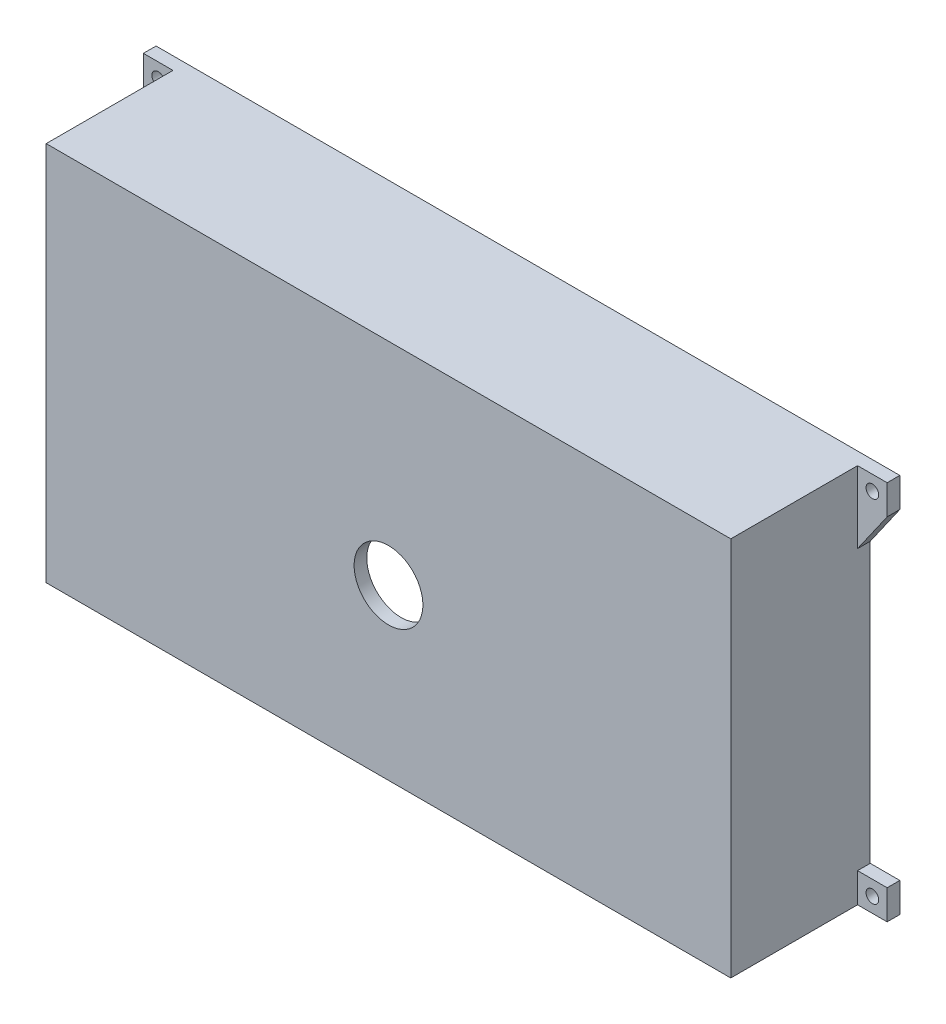
ISO-10303-21;
HEADER;
FILE_DESCRIPTION(('STEP AP214'),'2;1');
FILE_NAME('part.step','',(''),(''),'','','');
FILE_SCHEMA(('AUTOMOTIVE_DESIGN { 1 0 10303 214 1 1 1 1 }'));
ENDSEC;
DATA;
#1=APPLICATION_CONTEXT('core data for automotive mechanical design processes');
#2=APPLICATION_PROTOCOL_DEFINITION('international standard','automotive_design',2000,#1);
#3=PRODUCT_CONTEXT('',#1,'mechanical');
#4=PRODUCT('Part','Part','',(#3));
#5=PRODUCT_RELATED_PRODUCT_CATEGORY('part','',(#4));
#6=PRODUCT_DEFINITION_FORMATION('','',#4);
#7=PRODUCT_DEFINITION_CONTEXT('part definition',#1,'design');
#8=PRODUCT_DEFINITION('design','',#6,#7);
#9=PRODUCT_DEFINITION_SHAPE('','',#8);
#10=(LENGTH_UNIT() NAMED_UNIT(*) SI_UNIT(.MILLI.,.METRE.));
#11=(NAMED_UNIT(*) PLANE_ANGLE_UNIT() SI_UNIT($,.RADIAN.));
#12=(NAMED_UNIT(*) SI_UNIT($,.STERADIAN.) SOLID_ANGLE_UNIT());
#13=UNCERTAINTY_MEASURE_WITH_UNIT(LENGTH_MEASURE(1.E-05),#10,'distance_accuracy_value','');
#14=(GEOMETRIC_REPRESENTATION_CONTEXT(3) GLOBAL_UNCERTAINTY_ASSIGNED_CONTEXT((#13)) GLOBAL_UNIT_ASSIGNED_CONTEXT((#10,
#11,#12)) REPRESENTATION_CONTEXT('',''));
#15=CARTESIAN_POINT('',(0.,0.,0.));
#16=DIRECTION('',(0.,0.,1.));
#17=DIRECTION('',(1.,0.,0.));
#18=AXIS2_PLACEMENT_3D('',#15,#16,#17);
#19=CARTESIAN_POINT('',(162.,0.,33.));
#20=DIRECTION('',(-1.,0.,0.));
#21=DIRECTION('',(0.,0.,1.));
#22=AXIS2_PLACEMENT_3D('',#19,#20,#21);
#23=PLANE('',#22);
#24=DIRECTION('',(0.,0.,-1.));
#25=VECTOR('',#24,1.);
#26=CARTESIAN_POINT('',(162.,73.,3.));
#27=LINE('',#26,#25);
#28=CARTESIAN_POINT('',(162.,73.,3.));
#29=VERTEX_POINT('',#28);
#30=CARTESIAN_POINT('',(162.,73.,0.));
#31=VERTEX_POINT('',#30);
#32=EDGE_CURVE('E62',#29,#31,#27,.T.);
#33=ORIENTED_EDGE('',*,*,#32,.F.);
#34=DIRECTION('',(0.,1.,0.));
#35=VECTOR('',#34,1.);
#36=CARTESIAN_POINT('',(162.,0.,3.));
#37=LINE('',#36,#35);
#38=CARTESIAN_POINT('',(162.,90.,3.));
#39=VERTEX_POINT('',#38);
#40=EDGE_CURVE('E218',#29,#39,#37,.T.);
#41=ORIENTED_EDGE('',*,*,#40,.T.);
#42=DIRECTION('',(0.,0.,-1.));
#43=VECTOR('',#42,1.);
#44=CARTESIAN_POINT('',(162.,90.,33.));
#45=LINE('',#44,#43);
#46=CARTESIAN_POINT('',(162.,90.,33.));
#47=VERTEX_POINT('',#46);
#48=EDGE_CURVE('E356',#47,#39,#45,.T.);
#49=ORIENTED_EDGE('',*,*,#48,.F.);
#50=DIRECTION('',(0.,1.,0.));
#51=VECTOR('',#50,1.);
#52=CARTESIAN_POINT('',(162.,0.,33.));
#53=LINE('',#52,#51);
#54=CARTESIAN_POINT('',(162.,0.,33.));
#55=VERTEX_POINT('',#54);
#56=EDGE_CURVE('E340',#55,#47,#53,.T.);
#57=ORIENTED_EDGE('',*,*,#56,.F.);
#58=DIRECTION('',(0.,0.,-1.));
#59=VECTOR('',#58,1.);
#60=CARTESIAN_POINT('',(162.,0.,33.));
#61=LINE('',#60,#59);
#62=CARTESIAN_POINT('',(162.,0.,3.));
#63=VERTEX_POINT('',#62);
#64=EDGE_CURVE('E47',#55,#63,#61,.T.);
#65=ORIENTED_EDGE('',*,*,#64,.T.);
#66=DIRECTION('',(0.,1.,0.));
#67=VECTOR('',#66,1.);
#68=CARTESIAN_POINT('',(162.,0.,3.));
#69=LINE('',#68,#67);
#70=CARTESIAN_POINT('',(162.,6.99999999999998,3.));
#71=VERTEX_POINT('',#70);
#72=EDGE_CURVE('E243',#63,#71,#69,.T.);
#73=ORIENTED_EDGE('',*,*,#72,.T.);
#74=DIRECTION('',(0.,0.,-1.));
#75=VECTOR('',#74,1.);
#76=CARTESIAN_POINT('',(162.,6.99999999999998,3.));
#77=LINE('',#76,#75);
#78=CARTESIAN_POINT('',(162.,6.99999999999998,0.));
#79=VERTEX_POINT('',#78);
#80=EDGE_CURVE('E257',#71,#79,#77,.T.);
#81=ORIENTED_EDGE('',*,*,#80,.T.);
#82=DIRECTION('',(0.,1.,0.));
#83=VECTOR('',#82,1.);
#84=CARTESIAN_POINT('',(162.,0.,0.));
#85=LINE('',#84,#83);
#86=EDGE_CURVE('E351',#79,#31,#85,.T.);
#87=ORIENTED_EDGE('',*,*,#86,.T.);
#88=EDGE_LOOP('',(#33,#41,#49,#57,#65,#73,#81,#87));
#89=FACE_BOUND('',#88,.T.);
#90=ADVANCED_FACE('F39',(#89),#23,.F.);
#91=CARTESIAN_POINT('',(3.56857400772371E-13,0.,33.));
#92=DIRECTION('',(1.,0.,0.));
#93=DIRECTION('',(0.,1.,0.));
#94=AXIS2_PLACEMENT_3D('',#91,#92,#93);
#95=PLANE('',#94);
#96=DIRECTION('',(0.,0.,-1.));
#97=VECTOR('',#96,1.);
#98=CARTESIAN_POINT('',(0.,7.00000000000003,3.));
#99=LINE('',#98,#97);
#100=CARTESIAN_POINT('',(3.29101825156742E-13,7.00000000000003,3.));
#101=VERTEX_POINT('',#100);
#102=CARTESIAN_POINT('',(3.29101825156742E-13,7.00000000000003,0.));
#103=VERTEX_POINT('',#102);
#104=EDGE_CURVE('E297',#101,#103,#99,.T.);
#105=ORIENTED_EDGE('',*,*,#104,.F.);
#106=DIRECTION('',(0.,1.,0.));
#107=VECTOR('',#106,1.);
#108=CARTESIAN_POINT('',(0.,0.,3.));
#109=LINE('',#108,#107);
#110=CARTESIAN_POINT('',(0.,0.,3.));
#111=VERTEX_POINT('',#110);
#112=EDGE_CURVE('E283',#111,#101,#109,.T.);
#113=ORIENTED_EDGE('',*,*,#112,.F.);
#114=DIRECTION('',(0.,0.,-1.));
#115=VECTOR('',#114,1.);
#116=CARTESIAN_POINT('',(0.,0.,33.));
#117=LINE('',#116,#115);
#118=CARTESIAN_POINT('',(0.,0.,33.));
#119=VERTEX_POINT('',#118);
#120=EDGE_CURVE('E11',#119,#111,#117,.T.);
#121=ORIENTED_EDGE('',*,*,#120,.F.);
#122=DIRECTION('',(0.,-1.,0.));
#123=VECTOR('',#122,1.);
#124=CARTESIAN_POINT('',(3.56857400772371E-13,0.,33.));
#125=LINE('',#124,#123);
#126=CARTESIAN_POINT('',(0.,90.,33.));
#127=VERTEX_POINT('',#126);
#128=EDGE_CURVE('E334',#127,#119,#125,.T.);
#129=ORIENTED_EDGE('',*,*,#128,.F.);
#130=DIRECTION('',(0.,0.,-1.));
#131=VECTOR('',#130,1.);
#132=CARTESIAN_POINT('',(0.,90.,33.));
#133=LINE('',#132,#131);
#134=CARTESIAN_POINT('',(0.,90.,3.));
#135=VERTEX_POINT('',#134);
#136=EDGE_CURVE('E345',#127,#135,#133,.T.);
#137=ORIENTED_EDGE('',*,*,#136,.T.);
#138=DIRECTION('',(0.,-1.,0.));
#139=VECTOR('',#138,1.);
#140=CARTESIAN_POINT('',(-2.02615701994091E-13,0.,3.));
#141=LINE('',#140,#139);
#142=CARTESIAN_POINT('',(0.,73.,3.));
#143=VERTEX_POINT('',#142);
#144=EDGE_CURVE('E307',#135,#143,#141,.T.);
#145=ORIENTED_EDGE('',*,*,#144,.T.);
#146=DIRECTION('',(0.,0.,-1.));
#147=VECTOR('',#146,1.);
#148=CARTESIAN_POINT('',(0.,73.,3.));
#149=LINE('',#148,#147);
#150=CARTESIAN_POINT('',(0.,73.,0.));
#151=VERTEX_POINT('',#150);
#152=EDGE_CURVE('E330',#143,#151,#149,.T.);
#153=ORIENTED_EDGE('',*,*,#152,.T.);
#154=DIRECTION('',(0.,-1.,0.));
#155=VECTOR('',#154,1.);
#156=CARTESIAN_POINT('',(3.56857400772371E-13,0.,0.));
#157=LINE('',#156,#155);
#158=EDGE_CURVE('E333',#151,#103,#157,.T.);
#159=ORIENTED_EDGE('',*,*,#158,.T.);
#160=EDGE_LOOP('',(#105,#113,#121,#129,#137,#145,#153,#159));
#161=FACE_BOUND('',#160,.T.);
#162=ADVANCED_FACE('F41',(#161),#95,.F.);
#163=CARTESIAN_POINT('',(0.,0.,33.));
#164=DIRECTION('',(0.,1.,0.));
#165=DIRECTION('',(0.,0.,1.));
#166=AXIS2_PLACEMENT_3D('',#163,#164,#165);
#167=PLANE('',#166);
#168=DIRECTION('',(1.,0.,0.));
#169=VECTOR('',#168,1.);
#170=CARTESIAN_POINT('',(0.,0.,0.));
#171=LINE('',#170,#169);
#172=CARTESIAN_POINT('',(-7.00000000000001,0.,0.));
#173=VERTEX_POINT('',#172);
#174=CARTESIAN_POINT('',(2.99999999999999,0.,0.));
#175=VERTEX_POINT('',#174);
#176=EDGE_CURVE('E348',#173,#175,#171,.T.);
#177=ORIENTED_EDGE('',*,*,#176,.T.);
#178=DIRECTION('',(0.,0.,-1.));
#179=VECTOR('',#178,1.);
#180=CARTESIAN_POINT('',(2.99999999999999,0.,30.));
#181=LINE('',#180,#179);
#182=CARTESIAN_POINT('',(2.99999999999999,0.,30.));
#183=VERTEX_POINT('',#182);
#184=EDGE_CURVE('E208',#183,#175,#181,.T.);
#185=ORIENTED_EDGE('',*,*,#184,.F.);
#186=DIRECTION('',(-1.,0.,0.));
#187=VECTOR('',#186,1.);
#188=CARTESIAN_POINT('',(159.,0.,30.));
#189=LINE('',#188,#187);
#190=CARTESIAN_POINT('',(159.,0.,30.));
#191=VERTEX_POINT('',#190);
#192=EDGE_CURVE('E183',#191,#183,#189,.T.);
#193=ORIENTED_EDGE('',*,*,#192,.F.);
#194=DIRECTION('',(0.,0.,-1.));
#195=VECTOR('',#194,1.);
#196=CARTESIAN_POINT('',(159.,0.,30.));
#197=LINE('',#196,#195);
#198=CARTESIAN_POINT('',(159.,0.,0.));
#199=VERTEX_POINT('',#198);
#200=EDGE_CURVE('E211',#191,#199,#197,.T.);
#201=ORIENTED_EDGE('',*,*,#200,.T.);
#202=CARTESIAN_POINT('',(169.,0.,0.));
#203=VERTEX_POINT('',#202);
#204=EDGE_CURVE('E347',#199,#203,#171,.T.);
#205=ORIENTED_EDGE('',*,*,#204,.T.);
#206=DIRECTION('',(0.,0.,-1.));
#207=VECTOR('',#206,1.);
#208=CARTESIAN_POINT('',(169.,0.,3.));
#209=LINE('',#208,#207);
#210=CARTESIAN_POINT('',(169.,0.,3.));
#211=VERTEX_POINT('',#210);
#212=EDGE_CURVE('E269',#211,#203,#209,.T.);
#213=ORIENTED_EDGE('',*,*,#212,.F.);
#214=DIRECTION('',(1.,0.,0.));
#215=VECTOR('',#214,1.);
#216=CARTESIAN_POINT('',(0.,6.42343321390269E-13,3.));
#217=LINE('',#216,#215);
#218=EDGE_CURVE('E246',#63,#211,#217,.T.);
#219=ORIENTED_EDGE('',*,*,#218,.F.);
#220=ORIENTED_EDGE('',*,*,#64,.F.);
#221=DIRECTION('',(1.,0.,0.));
#222=VECTOR('',#221,1.);
#223=CARTESIAN_POINT('',(0.,0.,33.));
#224=LINE('',#223,#222);
#225=EDGE_CURVE('E337',#119,#55,#224,.T.);
#226=ORIENTED_EDGE('',*,*,#225,.F.);
#227=ORIENTED_EDGE('',*,*,#120,.T.);
#228=DIRECTION('',(-1.,0.,0.));
#229=VECTOR('',#228,1.);
#230=CARTESIAN_POINT('',(0.,0.,3.));
#231=LINE('',#230,#229);
#232=CARTESIAN_POINT('',(-7.00000000000001,0.,3.));
#233=VERTEX_POINT('',#232);
#234=EDGE_CURVE('E280',#111,#233,#231,.T.);
#235=ORIENTED_EDGE('',*,*,#234,.T.);
#236=DIRECTION('',(0.,0.,-1.));
#237=VECTOR('',#236,1.);
#238=CARTESIAN_POINT('',(-7.00000000000001,0.,3.));
#239=LINE('',#238,#237);
#240=EDGE_CURVE('E300',#233,#173,#239,.T.);
#241=ORIENTED_EDGE('',*,*,#240,.T.);
#242=EDGE_LOOP('',(#177,#185,#193,#201,#205,#213,#219,#220,#226,#227,#235,#241));
#243=FACE_BOUND('',#242,.T.);
#244=ADVANCED_FACE('F364',(#243),#167,.F.);
#245=CARTESIAN_POINT('',(0.,90.,33.));
#246=DIRECTION('',(0.,1.,0.));
#247=DIRECTION('',(0.,0.,1.));
#248=AXIS2_PLACEMENT_3D('',#245,#246,#247);
#249=PLANE('',#248);
#250=DIRECTION('',(1.,0.,0.));
#251=VECTOR('',#250,1.);
#252=CARTESIAN_POINT('',(0.,90.,0.));
#253=LINE('',#252,#251);
#254=CARTESIAN_POINT('',(-7.00000000000001,90.,0.));
#255=VERTEX_POINT('',#254);
#256=CARTESIAN_POINT('',(169.,90.,0.));
#257=VERTEX_POINT('',#256);
#258=EDGE_CURVE('E338',#255,#257,#253,.T.);
#259=ORIENTED_EDGE('',*,*,#258,.F.);
#260=DIRECTION('',(0.,0.,-1.));
#261=VECTOR('',#260,1.);
#262=CARTESIAN_POINT('',(-7.00000000000001,90.,3.));
#263=LINE('',#262,#261);
#264=CARTESIAN_POINT('',(-7.00000000000001,90.,3.));
#265=VERTEX_POINT('',#264);
#266=EDGE_CURVE('E327',#265,#255,#263,.T.);
#267=ORIENTED_EDGE('',*,*,#266,.F.);
#268=DIRECTION('',(-1.,0.,0.));
#269=VECTOR('',#268,1.);
#270=CARTESIAN_POINT('',(0.,90.,3.));
#271=LINE('',#270,#269);
#272=EDGE_CURVE('E311',#135,#265,#271,.T.);
#273=ORIENTED_EDGE('',*,*,#272,.F.);
#274=ORIENTED_EDGE('',*,*,#136,.F.);
#275=DIRECTION('',(1.,0.,0.));
#276=VECTOR('',#275,1.);
#277=CARTESIAN_POINT('',(0.,90.,33.));
#278=LINE('',#277,#276);
#279=EDGE_CURVE('E342',#127,#47,#278,.T.);
#280=ORIENTED_EDGE('',*,*,#279,.T.);
#281=ORIENTED_EDGE('',*,*,#48,.T.);
#282=DIRECTION('',(1.,0.,0.));
#283=VECTOR('',#282,1.);
#284=CARTESIAN_POINT('',(0.,90.,3.));
#285=LINE('',#284,#283);
#286=CARTESIAN_POINT('',(169.,90.,3.));
#287=VERTEX_POINT('',#286);
#288=EDGE_CURVE('E226',#39,#287,#285,.T.);
#289=ORIENTED_EDGE('',*,*,#288,.T.);
#290=DIRECTION('',(0.,0.,-1.));
#291=VECTOR('',#290,1.);
#292=CARTESIAN_POINT('',(169.,90.,3.));
#293=LINE('',#292,#291);
#294=EDGE_CURVE('E229',#287,#257,#293,.T.);
#295=ORIENTED_EDGE('',*,*,#294,.T.);
#296=EDGE_LOOP('',(#259,#267,#273,#274,#280,#281,#289,#295));
#297=FACE_BOUND('',#296,.T.);
#298=ADVANCED_FACE('F390',(#297),#249,.T.);
#299=CARTESIAN_POINT('',(0.,0.,33.));
#300=DIRECTION('',(0.,0.,1.));
#301=DIRECTION('',(1.,0.,0.));
#302=AXIS2_PLACEMENT_3D('',#299,#300,#301);
#303=PLANE('',#302);
#304=CARTESIAN_POINT('',(81.,40.,33.));
#305=DIRECTION('',(0.,0.,-1.));
#306=DIRECTION('',(-1.,0.,0.));
#307=AXIS2_PLACEMENT_3D('',#304,#305,#306);
#308=CIRCLE('',#307,8.13770312168968);
#309=CARTESIAN_POINT('',(72.8622968783103,40.,33.));
#310=VERTEX_POINT('',#309);
#311=EDGE_CURVE('E779',#310,#310,#308,.T.);
#312=ORIENTED_EDGE('',*,*,#311,.T.);
#313=EDGE_LOOP('',(#312));
#314=FACE_BOUND('',#313,.T.);
#315=ORIENTED_EDGE('',*,*,#128,.T.);
#316=ORIENTED_EDGE('',*,*,#225,.T.);
#317=ORIENTED_EDGE('',*,*,#56,.T.);
#318=ORIENTED_EDGE('',*,*,#279,.F.);
#319=EDGE_LOOP('',(#315,#316,#317,#318));
#320=FACE_BOUND('',#319,.T.);
#321=ADVANCED_FACE('F394',(#314,#320),#303,.T.);
#322=CARTESIAN_POINT('',(0.,0.,0.));
#323=DIRECTION('',(0.,0.,1.));
#324=DIRECTION('',(1.,0.,0.));
#325=AXIS2_PLACEMENT_3D('',#322,#323,#324);
#326=PLANE('',#325);
#327=DIRECTION('',(1.,0.,0.));
#328=VECTOR('',#327,1.);
#329=CARTESIAN_POINT('',(159.,87.,0.));
#330=LINE('',#329,#328);
#331=CARTESIAN_POINT('',(3.,87.,0.));
#332=VERTEX_POINT('',#331);
#333=CARTESIAN_POINT('',(159.,87.,0.));
#334=VERTEX_POINT('',#333);
#335=EDGE_CURVE('E198',#332,#334,#330,.T.);
#336=ORIENTED_EDGE('',*,*,#335,.F.);
#337=DIRECTION('',(0.,1.,0.));
#338=VECTOR('',#337,1.);
#339=CARTESIAN_POINT('',(3.,87.,0.));
#340=LINE('',#339,#338);
#341=EDGE_CURVE('E54',#175,#332,#340,.T.);
#342=ORIENTED_EDGE('',*,*,#341,.F.);
#343=ORIENTED_EDGE('',*,*,#176,.F.);
#344=DIRECTION('',(0.,1.,0.));
#345=VECTOR('',#344,1.);
#346=CARTESIAN_POINT('',(-7.00000000000001,0.,0.));
#347=LINE('',#346,#345);
#348=CARTESIAN_POINT('',(-7.00000000000001,7.00000000000003,0.));
#349=VERTEX_POINT('',#348);
#350=EDGE_CURVE('E291',#173,#349,#347,.T.);
#351=ORIENTED_EDGE('',*,*,#350,.T.);
#352=DIRECTION('',(-1.,0.,0.));
#353=VECTOR('',#352,1.);
#354=CARTESIAN_POINT('',(0.,7.00000000000003,0.));
#355=LINE('',#354,#353);
#356=EDGE_CURVE('E277',#103,#349,#355,.T.);
#357=ORIENTED_EDGE('',*,*,#356,.F.);
#358=ORIENTED_EDGE('',*,*,#158,.F.);
#359=DIRECTION('',(-0.573462344363329,0.81923192051904,0.));
#360=VECTOR('',#359,1.);
#361=CARTESIAN_POINT('',(34.2953020134228,24.006711409396,0.));
#362=LINE('',#361,#360);
#363=CARTESIAN_POINT('',(-7.00000000000001,83.,0.));
#364=VERTEX_POINT('',#363);
#365=EDGE_CURVE('E303',#151,#364,#362,.T.);
#366=ORIENTED_EDGE('',*,*,#365,.T.);
#367=DIRECTION('',(0.,-1.,0.));
#368=VECTOR('',#367,1.);
#369=CARTESIAN_POINT('',(-7.00000000000001,0.,0.));
#370=LINE('',#369,#368);
#371=EDGE_CURVE('E321',#255,#364,#370,.T.);
#372=ORIENTED_EDGE('',*,*,#371,.F.);
#373=ORIENTED_EDGE('',*,*,#258,.T.);
#374=DIRECTION('',(0.,-1.,0.));
#375=VECTOR('',#374,1.);
#376=CARTESIAN_POINT('',(169.,0.,0.));
#377=LINE('',#376,#375);
#378=CARTESIAN_POINT('',(169.,83.,0.));
#379=VERTEX_POINT('',#378);
#380=EDGE_CURVE('E219',#257,#379,#377,.T.);
#381=ORIENTED_EDGE('',*,*,#380,.T.);
#382=DIRECTION('',(0.573462344363329,0.81923192051904,0.));
#383=VECTOR('',#382,1.);
#384=CARTESIAN_POINT('',(74.4295302013421,-52.1006711409396,0.));
#385=LINE('',#384,#383);
#386=EDGE_CURVE('E232',#31,#379,#385,.T.);
#387=ORIENTED_EDGE('',*,*,#386,.F.);
#388=ORIENTED_EDGE('',*,*,#86,.F.);
#389=DIRECTION('',(1.,0.,0.));
#390=VECTOR('',#389,1.);
#391=CARTESIAN_POINT('',(0.,6.99999999999998,0.));
#392=LINE('',#391,#390);
#393=CARTESIAN_POINT('',(169.,6.99999999999998,0.));
#394=VERTEX_POINT('',#393);
#395=EDGE_CURVE('E260',#79,#394,#392,.T.);
#396=ORIENTED_EDGE('',*,*,#395,.T.);
#397=DIRECTION('',(0.,1.,0.));
#398=VECTOR('',#397,1.);
#399=CARTESIAN_POINT('',(169.,0.,0.));
#400=LINE('',#399,#398);
#401=EDGE_CURVE('E242',#203,#394,#400,.T.);
#402=ORIENTED_EDGE('',*,*,#401,.F.);
#403=ORIENTED_EDGE('',*,*,#204,.F.);
#404=DIRECTION('',(0.,-1.,0.));
#405=VECTOR('',#404,1.);
#406=CARTESIAN_POINT('',(159.,87.,0.));
#407=LINE('',#406,#405);
#408=EDGE_CURVE('E196',#334,#199,#407,.T.);
#409=ORIENTED_EDGE('',*,*,#408,.F.);
#410=EDGE_LOOP('',(#336,#342,#343,#351,#357,#358,#366,#372,#373,#381,#387,#388,#396,#402,#403,#409));
#411=FACE_BOUND('',#410,.T.);
#412=CARTESIAN_POINT('',(-3.5,86.5,0.));
#413=DIRECTION('',(0.,0.,1.));
#414=DIRECTION('',(1.,0.,0.));
#415=AXIS2_PLACEMENT_3D('',#412,#413,#414);
#416=CIRCLE('',#415,1.5);
#417=CARTESIAN_POINT('',(-2.00000000000001,86.5,0.));
#418=VERTEX_POINT('',#417);
#419=EDGE_CURVE('E308',#418,#418,#416,.F.);
#420=ORIENTED_EDGE('',*,*,#419,.F.);
#421=EDGE_LOOP('',(#420));
#422=FACE_BOUND('',#421,.T.);
#423=CARTESIAN_POINT('',(-3.5,3.50000000000003,0.));
#424=DIRECTION('',(0.,0.,1.));
#425=DIRECTION('',(1.,0.,0.));
#426=AXIS2_PLACEMENT_3D('',#423,#424,#425);
#427=CIRCLE('',#426,1.5);
#428=CARTESIAN_POINT('',(-2.00000000000001,3.50000000000003,0.));
#429=VERTEX_POINT('',#428);
#430=EDGE_CURVE('E272',#429,#429,#427,.T.);
#431=ORIENTED_EDGE('',*,*,#430,.T.);
#432=EDGE_LOOP('',(#431));
#433=FACE_BOUND('',#432,.T.);
#434=CARTESIAN_POINT('',(165.5,3.49999999999998,0.));
#435=DIRECTION('',(0.,0.,1.));
#436=DIRECTION('',(1.,0.,0.));
#437=AXIS2_PLACEMENT_3D('',#434,#435,#436);
#438=CIRCLE('',#437,1.5);
#439=CARTESIAN_POINT('',(167.,3.49999999999998,0.));
#440=VERTEX_POINT('',#439);
#441=EDGE_CURVE('E247',#440,#440,#438,.F.);
#442=ORIENTED_EDGE('',*,*,#441,.F.);
#443=EDGE_LOOP('',(#442));
#444=FACE_BOUND('',#443,.T.);
#445=CARTESIAN_POINT('',(165.5,86.5,0.));
#446=DIRECTION('',(0.,0.,1.));
#447=DIRECTION('',(1.,0.,0.));
#448=AXIS2_PLACEMENT_3D('',#445,#446,#447);
#449=CIRCLE('',#448,1.5);
#450=CARTESIAN_POINT('',(167.,86.5,0.));
#451=VERTEX_POINT('',#450);
#452=EDGE_CURVE('E210',#451,#451,#449,.T.);
#453=ORIENTED_EDGE('',*,*,#452,.T.);
#454=EDGE_LOOP('',(#453));
#455=FACE_BOUND('',#454,.T.);
#456=ADVANCED_FACE('F377',(#411,#422,#433,#444,#455),#326,.F.);
#457=CARTESIAN_POINT('',(34.2953020134228,24.006711409396,3.));
#458=DIRECTION('',(-0.81923192051904,-0.573462344363329,0.));
#459=DIRECTION('',(0.573462344363329,-0.81923192051904,0.));
#460=AXIS2_PLACEMENT_3D('',#457,#458,#459);
#461=PLANE('',#460);
#462=ORIENTED_EDGE('',*,*,#365,.F.);
#463=ORIENTED_EDGE('',*,*,#152,.F.);
#464=DIRECTION('',(-0.573462344363329,0.81923192051904,0.));
#465=VECTOR('',#464,1.);
#466=CARTESIAN_POINT('',(34.2953020134228,24.006711409396,3.));
#467=LINE('',#466,#465);
#468=CARTESIAN_POINT('',(-7.00000000000001,83.,3.));
#469=VERTEX_POINT('',#468);
#470=EDGE_CURVE('E304',#143,#469,#467,.T.);
#471=ORIENTED_EDGE('',*,*,#470,.T.);
#472=DIRECTION('',(0.,0.,-1.));
#473=VECTOR('',#472,1.);
#474=CARTESIAN_POINT('',(-7.00000000000001,83.,3.));
#475=LINE('',#474,#473);
#476=EDGE_CURVE('E318',#469,#364,#475,.T.);
#477=ORIENTED_EDGE('',*,*,#476,.T.);
#478=EDGE_LOOP('',(#462,#463,#471,#477));
#479=FACE_BOUND('',#478,.T.);
#480=ADVANCED_FACE('F443',(#479),#461,.T.);
#481=CARTESIAN_POINT('',(-7.00000000000001,0.,3.));
#482=DIRECTION('',(1.,0.,0.));
#483=DIRECTION('',(0.,0.,-1.));
#484=AXIS2_PLACEMENT_3D('',#481,#482,#483);
#485=PLANE('',#484);
#486=ORIENTED_EDGE('',*,*,#371,.T.);
#487=ORIENTED_EDGE('',*,*,#476,.F.);
#488=DIRECTION('',(0.,-1.,0.));
#489=VECTOR('',#488,1.);
#490=CARTESIAN_POINT('',(-7.00000000000001,0.,3.));
#491=LINE('',#490,#489);
#492=EDGE_CURVE('E313',#265,#469,#491,.T.);
#493=ORIENTED_EDGE('',*,*,#492,.F.);
#494=ORIENTED_EDGE('',*,*,#266,.T.);
#495=EDGE_LOOP('',(#486,#487,#493,#494));
#496=FACE_BOUND('',#495,.T.);
#497=ADVANCED_FACE('F448',(#496),#485,.F.);
#498=CARTESIAN_POINT('',(-3.5,86.5,3.));
#499=DIRECTION('',(0.,0.,-1.));
#500=DIRECTION('',(-1.,0.,0.));
#501=AXIS2_PLACEMENT_3D('',#498,#499,#500);
#502=CYLINDRICAL_SURFACE('',#501,1.5);
#503=CARTESIAN_POINT('',(-3.5,86.5,3.));
#504=DIRECTION('',(0.,0.,1.));
#505=DIRECTION('',(1.,0.,0.));
#506=AXIS2_PLACEMENT_3D('',#503,#504,#505);
#507=CIRCLE('',#506,1.5);
#508=CARTESIAN_POINT('',(-2.00000000000001,86.5,3.));
#509=VERTEX_POINT('',#508);
#510=EDGE_CURVE('E315',#509,#509,#507,.F.);
#511=ORIENTED_EDGE('',*,*,#510,.F.);
#512=EDGE_LOOP('',(#511));
#513=FACE_BOUND('',#512,.T.);
#514=ORIENTED_EDGE('',*,*,#419,.T.);
#515=EDGE_LOOP('',(#514));
#516=FACE_BOUND('',#515,.T.);
#517=ADVANCED_FACE('F452',(#513,#516),#502,.F.);
#518=CARTESIAN_POINT('',(0.,0.,3.));
#519=DIRECTION('',(0.,0.,1.));
#520=DIRECTION('',(1.,0.,0.));
#521=AXIS2_PLACEMENT_3D('',#518,#519,#520);
#522=PLANE('',#521);
#523=ORIENTED_EDGE('',*,*,#470,.F.);
#524=ORIENTED_EDGE('',*,*,#144,.F.);
#525=ORIENTED_EDGE('',*,*,#272,.T.);
#526=ORIENTED_EDGE('',*,*,#492,.T.);
#527=EDGE_LOOP('',(#523,#524,#525,#526));
#528=FACE_BOUND('',#527,.T.);
#529=ORIENTED_EDGE('',*,*,#510,.T.);
#530=EDGE_LOOP('',(#529));
#531=FACE_BOUND('',#530,.T.);
#532=ADVANCED_FACE('F456',(#528,#531),#522,.T.);
#533=CARTESIAN_POINT('',(-7.00000000000001,0.,3.));
#534=DIRECTION('',(-1.,0.,0.));
#535=DIRECTION('',(0.,0.,1.));
#536=AXIS2_PLACEMENT_3D('',#533,#534,#535);
#537=PLANE('',#536);
#538=ORIENTED_EDGE('',*,*,#350,.F.);
#539=ORIENTED_EDGE('',*,*,#240,.F.);
#540=DIRECTION('',(0.,1.,0.));
#541=VECTOR('',#540,1.);
#542=CARTESIAN_POINT('',(-7.00000000000001,0.,3.));
#543=LINE('',#542,#541);
#544=CARTESIAN_POINT('',(-7.00000000000001,7.00000000000003,3.));
#545=VERTEX_POINT('',#544);
#546=EDGE_CURVE('E276',#233,#545,#543,.T.);
#547=ORIENTED_EDGE('',*,*,#546,.T.);
#548=DIRECTION('',(0.,0.,-1.));
#549=VECTOR('',#548,1.);
#550=CARTESIAN_POINT('',(-7.00000000000001,7.00000000000003,3.));
#551=LINE('',#550,#549);
#552=EDGE_CURVE('E288',#545,#349,#551,.T.);
#553=ORIENTED_EDGE('',*,*,#552,.T.);
#554=EDGE_LOOP('',(#538,#539,#547,#553));
#555=FACE_BOUND('',#554,.T.);
#556=ADVANCED_FACE('F405',(#555),#537,.T.);
#557=CARTESIAN_POINT('',(-3.5,3.50000000000003,3.));
#558=DIRECTION('',(0.,0.,-1.));
#559=DIRECTION('',(-1.,0.,0.));
#560=AXIS2_PLACEMENT_3D('',#557,#558,#559);
#561=CYLINDRICAL_SURFACE('',#560,1.5);
#562=CARTESIAN_POINT('',(-3.5,3.50000000000003,3.));
#563=DIRECTION('',(0.,0.,1.));
#564=DIRECTION('',(1.,0.,0.));
#565=AXIS2_PLACEMENT_3D('',#562,#563,#564);
#566=CIRCLE('',#565,1.5);
#567=CARTESIAN_POINT('',(-2.00000000000001,3.50000000000003,3.));
#568=VERTEX_POINT('',#567);
#569=EDGE_CURVE('E273',#568,#568,#566,.T.);
#570=ORIENTED_EDGE('',*,*,#569,.T.);
#571=EDGE_LOOP('',(#570));
#572=FACE_BOUND('',#571,.T.);
#573=ORIENTED_EDGE('',*,*,#430,.F.);
#574=EDGE_LOOP('',(#573));
#575=FACE_BOUND('',#574,.T.);
#576=ADVANCED_FACE('F461',(#572,#575),#561,.F.);
#577=CARTESIAN_POINT('',(0.,7.00000000000003,3.));
#578=DIRECTION('',(0.,-1.,0.));
#579=DIRECTION('',(0.,0.,-1.));
#580=AXIS2_PLACEMENT_3D('',#577,#578,#579);
#581=PLANE('',#580);
#582=ORIENTED_EDGE('',*,*,#356,.T.);
#583=ORIENTED_EDGE('',*,*,#552,.F.);
#584=DIRECTION('',(-1.,0.,0.));
#585=VECTOR('',#584,1.);
#586=CARTESIAN_POINT('',(0.,7.00000000000003,3.));
#587=LINE('',#586,#585);
#588=EDGE_CURVE('E286',#101,#545,#587,.T.);
#589=ORIENTED_EDGE('',*,*,#588,.F.);
#590=ORIENTED_EDGE('',*,*,#104,.T.);
#591=EDGE_LOOP('',(#582,#583,#589,#590));
#592=FACE_BOUND('',#591,.T.);
#593=ADVANCED_FACE('F421',(#592),#581,.F.);
#594=CARTESIAN_POINT('',(0.,0.,3.));
#595=DIRECTION('',(0.,0.,1.));
#596=DIRECTION('',(1.,0.,0.));
#597=AXIS2_PLACEMENT_3D('',#594,#595,#596);
#598=PLANE('',#597);
#599=ORIENTED_EDGE('',*,*,#569,.F.);
#600=EDGE_LOOP('',(#599));
#601=FACE_BOUND('',#600,.T.);
#602=ORIENTED_EDGE('',*,*,#546,.F.);
#603=ORIENTED_EDGE('',*,*,#234,.F.);
#604=ORIENTED_EDGE('',*,*,#112,.T.);
#605=ORIENTED_EDGE('',*,*,#588,.T.);
#606=EDGE_LOOP('',(#602,#603,#604,#605));
#607=FACE_BOUND('',#606,.T.);
#608=ADVANCED_FACE('F400',(#601,#607),#598,.T.);
#609=CARTESIAN_POINT('',(169.,0.,3.));
#610=DIRECTION('',(-1.,0.,0.));
#611=DIRECTION('',(0.,0.,1.));
#612=AXIS2_PLACEMENT_3D('',#609,#610,#611);
#613=PLANE('',#612);
#614=ORIENTED_EDGE('',*,*,#401,.T.);
#615=DIRECTION('',(0.,0.,-1.));
#616=VECTOR('',#615,1.);
#617=CARTESIAN_POINT('',(169.,6.99999999999998,3.));
#618=LINE('',#617,#616);
#619=CARTESIAN_POINT('',(169.,6.99999999999998,3.));
#620=VERTEX_POINT('',#619);
#621=EDGE_CURVE('E267',#620,#394,#618,.T.);
#622=ORIENTED_EDGE('',*,*,#621,.F.);
#623=DIRECTION('',(0.,1.,0.));
#624=VECTOR('',#623,1.);
#625=CARTESIAN_POINT('',(169.,0.,3.));
#626=LINE('',#625,#624);
#627=EDGE_CURVE('E249',#211,#620,#626,.T.);
#628=ORIENTED_EDGE('',*,*,#627,.F.);
#629=ORIENTED_EDGE('',*,*,#212,.T.);
#630=EDGE_LOOP('',(#614,#622,#628,#629));
#631=FACE_BOUND('',#630,.T.);
#632=ADVANCED_FACE('F412',(#631),#613,.F.);
#633=CARTESIAN_POINT('',(0.,6.99999999999998,3.));
#634=DIRECTION('',(0.,1.,0.));
#635=DIRECTION('',(0.,0.,1.));
#636=AXIS2_PLACEMENT_3D('',#633,#634,#635);
#637=PLANE('',#636);
#638=ORIENTED_EDGE('',*,*,#395,.F.);
#639=ORIENTED_EDGE('',*,*,#80,.F.);
#640=DIRECTION('',(1.,0.,0.));
#641=VECTOR('',#640,1.);
#642=CARTESIAN_POINT('',(0.,6.99999999999998,3.));
#643=LINE('',#642,#641);
#644=EDGE_CURVE('E251',#71,#620,#643,.T.);
#645=ORIENTED_EDGE('',*,*,#644,.T.);
#646=ORIENTED_EDGE('',*,*,#621,.T.);
#647=EDGE_LOOP('',(#638,#639,#645,#646));
#648=FACE_BOUND('',#647,.T.);
#649=ADVANCED_FACE('F373',(#648),#637,.T.);
#650=CARTESIAN_POINT('',(165.5,3.49999999999998,3.));
#651=DIRECTION('',(0.,0.,-1.));
#652=DIRECTION('',(-1.,0.,0.));
#653=AXIS2_PLACEMENT_3D('',#650,#651,#652);
#654=CYLINDRICAL_SURFACE('',#653,1.5);
#655=CARTESIAN_POINT('',(165.5,3.49999999999998,3.));
#656=DIRECTION('',(0.,0.,1.));
#657=DIRECTION('',(1.,0.,0.));
#658=AXIS2_PLACEMENT_3D('',#655,#656,#657);
#659=CIRCLE('',#658,1.5);
#660=CARTESIAN_POINT('',(167.,3.49999999999998,3.));
#661=VERTEX_POINT('',#660);
#662=EDGE_CURVE('E254',#661,#661,#659,.F.);
#663=ORIENTED_EDGE('',*,*,#662,.F.);
#664=EDGE_LOOP('',(#663));
#665=FACE_BOUND('',#664,.T.);
#666=ORIENTED_EDGE('',*,*,#441,.T.);
#667=EDGE_LOOP('',(#666));
#668=FACE_BOUND('',#667,.T.);
#669=ADVANCED_FACE('F419',(#665,#668),#654,.F.);
#670=CARTESIAN_POINT('',(0.,0.,3.));
#671=DIRECTION('',(0.,0.,1.));
#672=DIRECTION('',(1.,0.,0.));
#673=AXIS2_PLACEMENT_3D('',#670,#671,#672);
#674=PLANE('',#673);
#675=ORIENTED_EDGE('',*,*,#72,.F.);
#676=ORIENTED_EDGE('',*,*,#218,.T.);
#677=ORIENTED_EDGE('',*,*,#627,.T.);
#678=ORIENTED_EDGE('',*,*,#644,.F.);
#679=EDGE_LOOP('',(#675,#676,#677,#678));
#680=FACE_BOUND('',#679,.T.);
#681=ORIENTED_EDGE('',*,*,#662,.T.);
#682=EDGE_LOOP('',(#681));
#683=FACE_BOUND('',#682,.T.);
#684=ADVANCED_FACE('F369',(#680,#683),#674,.T.);
#685=CARTESIAN_POINT('',(74.4295302013421,-52.1006711409396,3.));
#686=DIRECTION('',(-0.81923192051904,0.573462344363329,0.));
#687=DIRECTION('',(-0.573462344363329,-0.81923192051904,0.));
#688=AXIS2_PLACEMENT_3D('',#685,#686,#687);
#689=PLANE('',#688);
#690=ORIENTED_EDGE('',*,*,#386,.T.);
#691=DIRECTION('',(0.,0.,-1.));
#692=VECTOR('',#691,1.);
#693=CARTESIAN_POINT('',(169.,83.,3.));
#694=LINE('',#693,#692);
#695=CARTESIAN_POINT('',(169.,83.,3.));
#696=VERTEX_POINT('',#695);
#697=EDGE_CURVE('E239',#696,#379,#694,.T.);
#698=ORIENTED_EDGE('',*,*,#697,.F.);
#699=DIRECTION('',(0.573462344363329,0.81923192051904,0.));
#700=VECTOR('',#699,1.);
#701=CARTESIAN_POINT('',(74.4295302013421,-52.1006711409396,3.));
#702=LINE('',#701,#700);
#703=EDGE_CURVE('E221',#29,#696,#702,.T.);
#704=ORIENTED_EDGE('',*,*,#703,.F.);
#705=ORIENTED_EDGE('',*,*,#32,.T.);
#706=EDGE_LOOP('',(#690,#698,#704,#705));
#707=FACE_BOUND('',#706,.T.);
#708=ADVANCED_FACE('F383',(#707),#689,.F.);
#709=CARTESIAN_POINT('',(169.,0.,3.));
#710=DIRECTION('',(1.,0.,0.));
#711=DIRECTION('',(0.,0.,-1.));
#712=AXIS2_PLACEMENT_3D('',#709,#710,#711);
#713=PLANE('',#712);
#714=ORIENTED_EDGE('',*,*,#380,.F.);
#715=ORIENTED_EDGE('',*,*,#294,.F.);
#716=DIRECTION('',(0.,-1.,0.));
#717=VECTOR('',#716,1.);
#718=CARTESIAN_POINT('',(169.,0.,3.));
#719=LINE('',#718,#717);
#720=EDGE_CURVE('E223',#287,#696,#719,.T.);
#721=ORIENTED_EDGE('',*,*,#720,.T.);
#722=ORIENTED_EDGE('',*,*,#697,.T.);
#723=EDGE_LOOP('',(#714,#715,#721,#722));
#724=FACE_BOUND('',#723,.T.);
#725=ADVANCED_FACE('F480',(#724),#713,.T.);
#726=CARTESIAN_POINT('',(165.5,86.5,3.));
#727=DIRECTION('',(0.,0.,-1.));
#728=DIRECTION('',(-1.,0.,0.));
#729=AXIS2_PLACEMENT_3D('',#726,#727,#728);
#730=CYLINDRICAL_SURFACE('',#729,1.5);
#731=CARTESIAN_POINT('',(165.5,86.5,3.));
#732=DIRECTION('',(0.,0.,1.));
#733=DIRECTION('',(1.,0.,0.));
#734=AXIS2_PLACEMENT_3D('',#731,#732,#733);
#735=CIRCLE('',#734,1.5);
#736=CARTESIAN_POINT('',(167.,86.5,3.));
#737=VERTEX_POINT('',#736);
#738=EDGE_CURVE('E215',#737,#737,#735,.T.);
#739=ORIENTED_EDGE('',*,*,#738,.T.);
#740=EDGE_LOOP('',(#739));
#741=FACE_BOUND('',#740,.T.);
#742=ORIENTED_EDGE('',*,*,#452,.F.);
#743=EDGE_LOOP('',(#742));
#744=FACE_BOUND('',#743,.T.);
#745=ADVANCED_FACE('F482',(#741,#744),#730,.F.);
#746=CARTESIAN_POINT('',(0.,0.,3.));
#747=DIRECTION('',(0.,0.,1.));
#748=DIRECTION('',(1.,0.,0.));
#749=AXIS2_PLACEMENT_3D('',#746,#747,#748);
#750=PLANE('',#749);
#751=ORIENTED_EDGE('',*,*,#738,.F.);
#752=EDGE_LOOP('',(#751));
#753=FACE_BOUND('',#752,.T.);
#754=ORIENTED_EDGE('',*,*,#40,.F.);
#755=ORIENTED_EDGE('',*,*,#703,.T.);
#756=ORIENTED_EDGE('',*,*,#720,.F.);
#757=ORIENTED_EDGE('',*,*,#288,.F.);
#758=EDGE_LOOP('',(#754,#755,#756,#757));
#759=FACE_BOUND('',#758,.T.);
#760=ADVANCED_FACE('F388',(#753,#759),#750,.T.);
#761=CARTESIAN_POINT('',(3.,87.,30.));
#762=DIRECTION('',(-1.,0.,0.));
#763=DIRECTION('',(0.,-1.,0.));
#764=AXIS2_PLACEMENT_3D('',#761,#762,#763);
#765=PLANE('',#764);
#766=ORIENTED_EDGE('',*,*,#341,.T.);
#767=DIRECTION('',(0.,0.,-1.));
#768=VECTOR('',#767,1.);
#769=CARTESIAN_POINT('',(3.,87.,30.));
#770=LINE('',#769,#768);
#771=CARTESIAN_POINT('',(3.,87.,30.));
#772=VERTEX_POINT('',#771);
#773=EDGE_CURVE('E173',#772,#332,#770,.T.);
#774=ORIENTED_EDGE('',*,*,#773,.F.);
#775=DIRECTION('',(0.,1.,0.));
#776=VECTOR('',#775,1.);
#777=CARTESIAN_POINT('',(3.,87.,30.));
#778=LINE('',#777,#776);
#779=EDGE_CURVE('E177',#183,#772,#778,.T.);
#780=ORIENTED_EDGE('',*,*,#779,.F.);
#781=ORIENTED_EDGE('',*,*,#184,.T.);
#782=EDGE_LOOP('',(#766,#774,#780,#781));
#783=FACE_BOUND('',#782,.T.);
#784=ADVANCED_FACE('F175',(#783),#765,.F.);
#785=CARTESIAN_POINT('',(159.,87.,30.));
#786=DIRECTION('',(1.,0.,0.));
#787=DIRECTION('',(0.,0.,-1.));
#788=AXIS2_PLACEMENT_3D('',#785,#786,#787);
#789=PLANE('',#788);
#790=ORIENTED_EDGE('',*,*,#408,.T.);
#791=ORIENTED_EDGE('',*,*,#200,.F.);
#792=DIRECTION('',(0.,-1.,0.));
#793=VECTOR('',#792,1.);
#794=CARTESIAN_POINT('',(159.,87.,30.));
#795=LINE('',#794,#793);
#796=CARTESIAN_POINT('',(159.,87.,30.));
#797=VERTEX_POINT('',#796);
#798=EDGE_CURVE('E191',#797,#191,#795,.T.);
#799=ORIENTED_EDGE('',*,*,#798,.F.);
#800=DIRECTION('',(0.,0.,-1.));
#801=VECTOR('',#800,1.);
#802=CARTESIAN_POINT('',(159.,87.,30.));
#803=LINE('',#802,#801);
#804=EDGE_CURVE('E182',#797,#334,#803,.T.);
#805=ORIENTED_EDGE('',*,*,#804,.T.);
#806=EDGE_LOOP('',(#790,#791,#799,#805));
#807=FACE_BOUND('',#806,.T.);
#808=ADVANCED_FACE('F410',(#807),#789,.F.);
#809=CARTESIAN_POINT('',(159.,87.,30.));
#810=DIRECTION('',(0.,1.,0.));
#811=DIRECTION('',(0.,0.,1.));
#812=AXIS2_PLACEMENT_3D('',#809,#810,#811);
#813=PLANE('',#812);
#814=ORIENTED_EDGE('',*,*,#335,.T.);
#815=ORIENTED_EDGE('',*,*,#804,.F.);
#816=DIRECTION('',(1.,0.,0.));
#817=VECTOR('',#816,1.);
#818=CARTESIAN_POINT('',(159.,87.,30.));
#819=LINE('',#818,#817);
#820=EDGE_CURVE('E186',#772,#797,#819,.T.);
#821=ORIENTED_EDGE('',*,*,#820,.F.);
#822=ORIENTED_EDGE('',*,*,#773,.T.);
#823=EDGE_LOOP('',(#814,#815,#821,#822));
#824=FACE_BOUND('',#823,.T.);
#825=ADVANCED_FACE('F187',(#824),#813,.F.);
#826=CARTESIAN_POINT('',(0.,0.,30.));
#827=DIRECTION('',(0.,0.,-1.));
#828=DIRECTION('',(-1.,0.,0.));
#829=AXIS2_PLACEMENT_3D('',#826,#827,#828);
#830=PLANE('',#829);
#831=CARTESIAN_POINT('',(81.,40.,30.));
#832=DIRECTION('',(0.,0.,-1.));
#833=DIRECTION('',(-1.,0.,0.));
#834=AXIS2_PLACEMENT_3D('',#831,#832,#833);
#835=CIRCLE('',#834,8.13770312168968);
#836=CARTESIAN_POINT('',(72.8622968783103,40.,30.));
#837=VERTEX_POINT('',#836);
#838=EDGE_CURVE('E201',#837,#837,#835,.T.);
#839=ORIENTED_EDGE('',*,*,#838,.F.);
#840=EDGE_LOOP('',(#839));
#841=FACE_BOUND('',#840,.T.);
#842=ORIENTED_EDGE('',*,*,#779,.T.);
#843=ORIENTED_EDGE('',*,*,#820,.T.);
#844=ORIENTED_EDGE('',*,*,#798,.T.);
#845=ORIENTED_EDGE('',*,*,#192,.T.);
#846=EDGE_LOOP('',(#842,#843,#844,#845));
#847=FACE_BOUND('',#846,.T.);
#848=ADVANCED_FACE('F193',(#841,#847),#830,.T.);
#849=CARTESIAN_POINT('',(81.,40.,33.));
#850=DIRECTION('',(0.,0.,-1.));
#851=DIRECTION('',(-1.,0.,0.));
#852=AXIS2_PLACEMENT_3D('',#849,#850,#851);
#853=CYLINDRICAL_SURFACE('',#852,8.13770312168968);
#854=ORIENTED_EDGE('',*,*,#838,.T.);
#855=EDGE_LOOP('',(#854));
#856=FACE_BOUND('',#855,.T.);
#857=ORIENTED_EDGE('',*,*,#311,.F.);
#858=EDGE_LOOP('',(#857));
#859=FACE_BOUND('',#858,.T.);
#860=ADVANCED_FACE('F587',(#856,#859),#853,.F.);
#861=CLOSED_SHELL('',(#90,#162,#244,#298,#321,#456,#480,#497,#517,#532,#556,#576,#593,#608,#632,
#649,#669,#684,#708,#725,#745,#760,#784,#808,#825,#848,#860));
#862=MANIFOLD_SOLID_BREP('B2',#861);
#863=ADVANCED_BREP_SHAPE_REPRESENTATION('',(#18,#862),#14);
#864=SHAPE_DEFINITION_REPRESENTATION(#9,#863);
ENDSEC;
END-ISO-10303-21;
